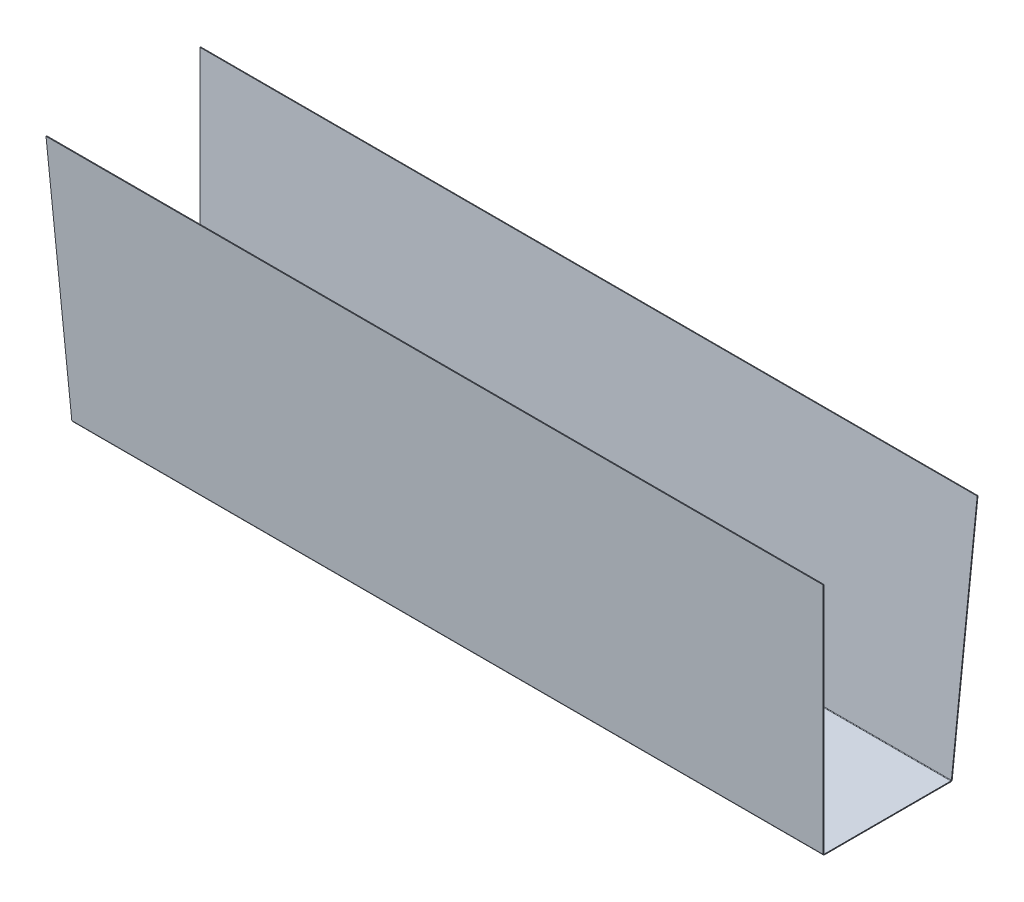
ISO-10303-21;
HEADER;
FILE_DESCRIPTION(('STEP AP214'),'2;1');
FILE_NAME('part.step','',(''),(''),'','','');
FILE_SCHEMA(('AUTOMOTIVE_DESIGN { 1 0 10303 214 1 1 1 1 }'));
ENDSEC;
DATA;
#1=APPLICATION_CONTEXT('core data for automotive mechanical design processes');
#2=APPLICATION_PROTOCOL_DEFINITION('international standard','automotive_design',2000,#1);
#3=PRODUCT_CONTEXT('',#1,'mechanical');
#4=PRODUCT('Part','Part','',(#3));
#5=PRODUCT_RELATED_PRODUCT_CATEGORY('part','',(#4));
#6=PRODUCT_DEFINITION_FORMATION('','',#4);
#7=PRODUCT_DEFINITION_CONTEXT('part definition',#1,'design');
#8=PRODUCT_DEFINITION('design','',#6,#7);
#9=PRODUCT_DEFINITION_SHAPE('','',#8);
#10=(LENGTH_UNIT() NAMED_UNIT(*) SI_UNIT(.MILLI.,.METRE.));
#11=(NAMED_UNIT(*) PLANE_ANGLE_UNIT() SI_UNIT($,.RADIAN.));
#12=(NAMED_UNIT(*) SI_UNIT($,.STERADIAN.) SOLID_ANGLE_UNIT());
#13=UNCERTAINTY_MEASURE_WITH_UNIT(LENGTH_MEASURE(1.E-05),#10,'distance_accuracy_value','');
#14=(GEOMETRIC_REPRESENTATION_CONTEXT(3) GLOBAL_UNCERTAINTY_ASSIGNED_CONTEXT((#13)) GLOBAL_UNIT_ASSIGNED_CONTEXT((#10,
#11,#12)) REPRESENTATION_CONTEXT('',''));
#15=CARTESIAN_POINT('',(0.,0.,0.));
#16=DIRECTION('',(0.,0.,1.));
#17=DIRECTION('',(1.,0.,0.));
#18=AXIS2_PLACEMENT_3D('',#15,#16,#17);
#19=CARTESIAN_POINT('',(1522.4125,-483.049083330536,-276.31164885721));
#20=DIRECTION('',(0.,0.0523359562429431,0.998629534754574));
#21=DIRECTION('',(0.,-0.998629534754574,0.0523359562429431));
#22=AXIS2_PLACEMENT_3D('',#19,#20,#21);
#23=PLANE('',#22);
#24=DIRECTION('',(0.0522644276887175,0.997264688634237,-0.0522644276887132));
#25=VECTOR('',#24,1.);
#26=CARTESIAN_POINT('',(1497.16612140968,-481.729600751976,-276.380800008955));
#27=LINE('',#26,#25);
#28=CARTESIAN_POINT('',(1497.14663522598,-482.101419286779,-276.36131382525));
#29=VERTEX_POINT('',#28);
#30=CARTESIAN_POINT('',(1522.40814578715,-0.0830833305356937,-301.622824386423));
#31=VERTEX_POINT('',#30);
#32=EDGE_CURVE('E310',#29,#31,#27,.T.);
#33=ORIENTED_EDGE('',*,*,#32,.F.);
#34=DIRECTION('',(-1.,0.,0.));
#35=VECTOR('',#34,1.);
#36=CARTESIAN_POINT('',(1522.4125,-482.101419286779,-276.36131382525));
#37=LINE('',#36,#35);
#38=CARTESIAN_POINT('',(25.265864774024,-482.101419286779,-276.36131382525));
#39=VERTEX_POINT('',#38);
#40=EDGE_CURVE('E50',#29,#39,#37,.T.);
#41=ORIENTED_EDGE('',*,*,#40,.T.);
#42=DIRECTION('',(-0.0522644276887175,0.997264688634237,-0.0522644276887132));
#43=VECTOR('',#42,1.);
#44=CARTESIAN_POINT('',(29.4049555143889,-561.079975466588,-272.222223084885));
#45=LINE('',#44,#43);
#46=CARTESIAN_POINT('',(0.00435421284876904,-0.0830833305356971,-301.622824386423));
#47=VERTEX_POINT('',#46);
#48=EDGE_CURVE('E224',#39,#47,#45,.T.);
#49=ORIENTED_EDGE('',*,*,#48,.T.);
#50=DIRECTION('',(-1.,0.,0.));
#51=VECTOR('',#50,1.);
#52=CARTESIAN_POINT('',(1522.4125,-0.0830833305356937,-301.622824386423));
#53=LINE('',#52,#51);
#54=EDGE_CURVE('E11',#31,#47,#53,.T.);
#55=ORIENTED_EDGE('',*,*,#54,.F.);
#56=EDGE_LOOP('',(#33,#41,#49,#55));
#57=FACE_BOUND('',#56,.T.);
#58=ADVANCED_FACE('F36',(#57),#23,.F.);
#59=CARTESIAN_POINT('',(1522.4125,0.,-300.0375));
#60=DIRECTION('',(0.,0.998629534754573,-0.0523359562429564));
#61=DIRECTION('',(0.,0.0523359562429564,0.998629534754573));
#62=AXIS2_PLACEMENT_3D('',#59,#60,#61);
#63=PLANE('',#62);
#64=DIRECTION('',(-1.,0.,0.));
#65=VECTOR('',#64,1.);
#66=CARTESIAN_POINT('',(1522.4125,0.,-300.0375));
#67=LINE('',#66,#65);
#68=CARTESIAN_POINT('',(1522.40814578715,1.11022302462516E-13,-300.0375));
#69=VERTEX_POINT('',#68);
#70=CARTESIAN_POINT('',(0.00435421284872284,1.11022302462516E-13,-300.0375));
#71=VERTEX_POINT('',#70);
#72=EDGE_CURVE('E43',#69,#71,#67,.T.);
#73=ORIENTED_EDGE('',*,*,#72,.F.);
#74=DIRECTION('',(0.,-0.0523359562429431,-0.998629534754574));
#75=VECTOR('',#74,1.);
#76=CARTESIAN_POINT('',(1522.40814578715,-0.0830833305356937,-301.622824386423));
#77=LINE('',#76,#75);
#78=EDGE_CURVE('E298',#31,#69,#77,.F.);
#79=ORIENTED_EDGE('',*,*,#78,.F.);
#80=ORIENTED_EDGE('',*,*,#54,.T.);
#81=DIRECTION('',(0.,-0.0523359562429431,-0.998629534754574));
#82=VECTOR('',#81,1.);
#83=CARTESIAN_POINT('',(0.00435421284876904,-0.0830833305356971,-301.622824386423));
#84=LINE('',#83,#82);
#85=EDGE_CURVE('E222',#47,#71,#84,.F.);
#86=ORIENTED_EDGE('',*,*,#85,.T.);
#87=EDGE_LOOP('',(#73,#79,#80,#86));
#88=FACE_BOUND('',#87,.T.);
#89=ADVANCED_FACE('F226',(#88),#63,.T.);
#90=CARTESIAN_POINT('',(1522.4125,-482.966,-274.726324470787));
#91=DIRECTION('',(0.,0.0523359562429431,0.998629534754574));
#92=DIRECTION('',(0.,-0.998629534754574,0.0523359562429431));
#93=AXIS2_PLACEMENT_3D('',#90,#91,#92);
#94=PLANE('',#93);
#95=DIRECTION('',(-1.,0.,0.));
#96=VECTOR('',#95,1.);
#97=CARTESIAN_POINT('',(1522.4125,-482.018335956243,-274.775989438827));
#98=LINE('',#97,#96);
#99=CARTESIAN_POINT('',(1497.14663522598,-482.018335956243,-274.775989438827));
#100=VERTEX_POINT('',#99);
#101=CARTESIAN_POINT('',(25.265864774024,-482.018335956243,-274.775989438827));
#102=VERTEX_POINT('',#101);
#103=EDGE_CURVE('E204',#100,#102,#98,.T.);
#104=ORIENTED_EDGE('',*,*,#103,.F.);
#105=DIRECTION('',(0.0522644276887175,0.997264688634237,-0.0522644276887132));
#106=VECTOR('',#105,1.);
#107=CARTESIAN_POINT('',(1497.16612140968,-481.64651742144,-274.795475622532));
#108=LINE('',#107,#106);
#109=EDGE_CURVE('E213',#100,#69,#108,.T.);
#110=ORIENTED_EDGE('',*,*,#109,.T.);
#111=ORIENTED_EDGE('',*,*,#72,.T.);
#112=DIRECTION('',(-0.0522644276887175,0.997264688634237,-0.0522644276887132));
#113=VECTOR('',#112,1.);
#114=CARTESIAN_POINT('',(29.4049555143889,-560.996892136052,-270.636898698462));
#115=LINE('',#114,#113);
#116=EDGE_CURVE('E212',#102,#71,#115,.T.);
#117=ORIENTED_EDGE('',*,*,#116,.F.);
#118=EDGE_LOOP('',(#104,#110,#111,#117));
#119=FACE_BOUND('',#118,.T.);
#120=ADVANCED_FACE('F211',(#119),#94,.T.);
#121=CARTESIAN_POINT('',(1522.4125,-481.966,-273.777359904072));
#122=DIRECTION('',(-1.,0.,0.));
#123=DIRECTION('',(0.,0.,1.));
#124=AXIS2_PLACEMENT_3D('',#121,#122,#123);
#125=CYLINDRICAL_SURFACE('',#124,1.);
#126=DIRECTION('',(-1.,0.,0.));
#127=VECTOR('',#126,1.);
#128=CARTESIAN_POINT('',(1522.4125,-482.966,-273.777359904072));
#129=LINE('',#128,#127);
#130=CARTESIAN_POINT('',(1497.01812712117,-482.966,-273.777359904072));
#131=VERTEX_POINT('',#130);
#132=CARTESIAN_POINT('',(25.3943728788268,-482.966,-273.777359904072));
#133=VERTEX_POINT('',#132);
#134=EDGE_CURVE('E202',#131,#133,#129,.T.);
#135=ORIENTED_EDGE('',*,*,#134,.F.);
#136=CARTESIAN_POINT('',(1497.15373225007,-481.966,-273.777359904072));
#137=DIRECTION('',(0.990930516924706,-0.134375260473553,0.));
#138=DIRECTION('',(-0.134375260473553,-0.990930516924706,0.));
#139=AXIS2_PLACEMENT_3D('',#136,#137,#138);
#140=ELLIPSE('',#139,1.00915249144152,1.);
#141=EDGE_CURVE('E181',#131,#100,#140,.T.);
#142=ORIENTED_EDGE('',*,*,#141,.T.);
#143=ORIENTED_EDGE('',*,*,#103,.T.);
#144=CARTESIAN_POINT('',(25.2587677499319,-481.966,-273.777359904072));
#145=DIRECTION('',(0.99093051692473,0.134375260473377,0.));
#146=DIRECTION('',(-0.134375260473377,0.99093051692473,0.));
#147=AXIS2_PLACEMENT_3D('',#144,#145,#146);
#148=ELLIPSE('',#147,1.0091524914415,1.);
#149=EDGE_CURVE('E282',#133,#102,#148,.T.);
#150=ORIENTED_EDGE('',*,*,#149,.F.);
#151=EDGE_LOOP('',(#135,#142,#143,#150));
#152=FACE_BOUND('',#151,.T.);
#153=ADVANCED_FACE('F341',(#152),#125,.F.);
#154=CARTESIAN_POINT('',(1522.4125,-482.966,-25.3111755292116));
#155=DIRECTION('',(0.,1.,0.));
#156=DIRECTION('',(0.,0.,1.));
#157=AXIS2_PLACEMENT_3D('',#154,#155,#156);
#158=PLANE('',#157);
#159=DIRECTION('',(-1.,0.,0.));
#160=VECTOR('',#159,1.);
#161=CARTESIAN_POINT('',(1522.4125,-482.966,-26.2601400959265));
#162=LINE('',#161,#160);
#163=CARTESIAN_POINT('',(1497.01812712117,-482.966,-26.2601400959265));
#164=VERTEX_POINT('',#163);
#165=CARTESIAN_POINT('',(25.3943728788268,-482.966,-26.2601400959265));
#166=VERTEX_POINT('',#165);
#167=EDGE_CURVE('E200',#164,#166,#162,.T.);
#168=ORIENTED_EDGE('',*,*,#167,.F.);
#169=DIRECTION('',(0.,0.,1.));
#170=VECTOR('',#169,1.);
#171=CARTESIAN_POINT('',(1497.01812712117,-482.966,-25.3111755292116));
#172=LINE('',#171,#170);
#173=EDGE_CURVE('E297',#131,#164,#172,.T.);
#174=ORIENTED_EDGE('',*,*,#173,.F.);
#175=ORIENTED_EDGE('',*,*,#134,.T.);
#176=DIRECTION('',(0.,0.,1.));
#177=VECTOR('',#176,1.);
#178=CARTESIAN_POINT('',(25.3943728788268,-482.966,-25.3111755292116));
#179=LINE('',#178,#177);
#180=EDGE_CURVE('E231',#133,#166,#179,.T.);
#181=ORIENTED_EDGE('',*,*,#180,.T.);
#182=EDGE_LOOP('',(#168,#174,#175,#181));
#183=FACE_BOUND('',#182,.T.);
#184=ADVANCED_FACE('F336',(#183),#158,.T.);
#185=CARTESIAN_POINT('',(1522.4125,-481.966,-26.2601400959265));
#186=DIRECTION('',(-1.,0.,0.));
#187=DIRECTION('',(0.,0.,1.));
#188=AXIS2_PLACEMENT_3D('',#185,#186,#187);
#189=CYLINDRICAL_SURFACE('',#188,1.);
#190=DIRECTION('',(-1.,0.,0.));
#191=VECTOR('',#190,1.);
#192=CARTESIAN_POINT('',(1522.4125,-482.018335956243,-25.2615105611719));
#193=LINE('',#192,#191);
#194=CARTESIAN_POINT('',(1497.14663522598,-482.018335956243,-25.2615105611719));
#195=VERTEX_POINT('',#194);
#196=CARTESIAN_POINT('',(25.265864774024,-482.018335956243,-25.2615105611719));
#197=VERTEX_POINT('',#196);
#198=EDGE_CURVE('E198',#195,#197,#193,.T.);
#199=ORIENTED_EDGE('',*,*,#198,.F.);
#200=CARTESIAN_POINT('',(1497.15373225007,-481.966,-26.2601400959265));
#201=DIRECTION('',(0.990930516924706,-0.134375260473553,0.));
#202=DIRECTION('',(-0.134375260473553,-0.990930516924706,0.));
#203=AXIS2_PLACEMENT_3D('',#200,#201,#202);
#204=ELLIPSE('',#203,1.00915249144152,1.);
#205=EDGE_CURVE('E157',#195,#164,#204,.T.);
#206=ORIENTED_EDGE('',*,*,#205,.T.);
#207=ORIENTED_EDGE('',*,*,#167,.T.);
#208=CARTESIAN_POINT('',(25.2587677499319,-481.966,-26.2601400959265));
#209=DIRECTION('',(0.99093051692473,0.134375260473377,0.));
#210=DIRECTION('',(-0.134375260473377,0.99093051692473,0.));
#211=AXIS2_PLACEMENT_3D('',#208,#209,#210);
#212=ELLIPSE('',#211,1.0091524914415,1.);
#213=EDGE_CURVE('E326',#197,#166,#212,.T.);
#214=ORIENTED_EDGE('',*,*,#213,.F.);
#215=EDGE_LOOP('',(#199,#206,#207,#214));
#216=FACE_BOUND('',#215,.T.);
#217=ADVANCED_FACE('F347',(#216),#189,.F.);
#218=CARTESIAN_POINT('',(1522.4125,0.,0.));
#219=DIRECTION('',(0.,0.0523359562429404,-0.998629534754574));
#220=DIRECTION('',(0.,0.998629534754574,0.0523359562429404));
#221=AXIS2_PLACEMENT_3D('',#218,#219,#220);
#222=PLANE('',#221);
#223=DIRECTION('',(1.,0.,0.));
#224=VECTOR('',#223,1.);
#225=CARTESIAN_POINT('',(1522.4125,-30.2497913117226,-1.58532438642271));
#226=LINE('',#225,#224);
#227=CARTESIAN_POINT('',(1520.82717561358,-30.2497913117226,-1.58532438642271));
#228=VERTEX_POINT('',#227);
#229=CARTESIAN_POINT('',(1520.82282140073,-30.2497913117259,-1.58532438642289));
#230=VERTEX_POINT('',#229);
#231=EDGE_CURVE('E171',#228,#230,#226,.F.);
#232=ORIENTED_EDGE('',*,*,#231,.T.);
#233=DIRECTION('',(-0.0522644276887175,-0.997264688634237,-0.0522644276887105));
#234=VECTOR('',#233,1.);
#235=CARTESIAN_POINT('',(1522.40815768099,0.000226947966559967,1.18938389408619E-05));
#236=LINE('',#235,#234);
#237=EDGE_CURVE('E322',#230,#195,#236,.T.);
#238=ORIENTED_EDGE('',*,*,#237,.T.);
#239=ORIENTED_EDGE('',*,*,#198,.T.);
#240=DIRECTION('',(0.0522644276887175,-0.997264688634237,-0.0522644276887105));
#241=VECTOR('',#240,1.);
#242=CARTESIAN_POINT('',(4.16291924307988,-79.3501477666454,-4.15856503023079));
#243=LINE('',#242,#241);
#244=CARTESIAN_POINT('',(1.58967859927195,-30.2497913117259,-1.58532438642289));
#245=VERTEX_POINT('',#244);
#246=EDGE_CURVE('E245',#245,#197,#243,.T.);
#247=ORIENTED_EDGE('',*,*,#246,.F.);
#248=DIRECTION('',(1.,0.,0.));
#249=VECTOR('',#248,1.);
#250=CARTESIAN_POINT('',(1522.4125,-30.2497913117259,-1.58532438642289));
#251=LINE('',#250,#249);
#252=CARTESIAN_POINT('',(1.58532438642289,-30.2497913117259,-1.58532438642289));
#253=VERTEX_POINT('',#252);
#254=EDGE_CURVE('E248',#245,#253,#251,.F.);
#255=ORIENTED_EDGE('',*,*,#254,.T.);
#256=DIRECTION('',(0.0522644276887175,-0.997264688634237,-0.0522644276887105));
#257=VECTOR('',#256,1.);
#258=CARTESIAN_POINT('',(4.15857692407018,-79.350374714612,-4.15857692406973));
#259=LINE('',#258,#257);
#260=CARTESIAN_POINT('',(0.,0.,0.));
#261=VERTEX_POINT('',#260);
#262=EDGE_CURVE('E240',#261,#253,#259,.T.);
#263=ORIENTED_EDGE('',*,*,#262,.F.);
#264=DIRECTION('',(-1.,0.,0.));
#265=VECTOR('',#264,1.);
#266=CARTESIAN_POINT('',(1522.4125,0.,0.));
#267=LINE('',#266,#265);
#268=CARTESIAN_POINT('',(1522.4125,0.,0.));
#269=VERTEX_POINT('',#268);
#270=EDGE_CURVE('E190',#269,#261,#267,.T.);
#271=ORIENTED_EDGE('',*,*,#270,.F.);
#272=DIRECTION('',(-0.0522644276887175,-0.997264688634237,-0.0522644276887105));
#273=VECTOR('',#272,1.);
#274=CARTESIAN_POINT('',(1522.4125,0.,0.));
#275=LINE('',#274,#273);
#276=EDGE_CURVE('E58',#269,#228,#275,.T.);
#277=ORIENTED_EDGE('',*,*,#276,.T.);
#278=EDGE_LOOP('',(#232,#238,#239,#247,#255,#263,#271,#277));
#279=FACE_BOUND('',#278,.T.);
#280=ADVANCED_FACE('F351',(#279),#222,.T.);
#281=CARTESIAN_POINT('',(1522.4125,-0.0830833305356679,1.58532438642289));
#282=DIRECTION('',(0.,0.0523359562429404,-0.998629534754574));
#283=DIRECTION('',(0.,0.998629534754574,0.0523359562429404));
#284=AXIS2_PLACEMENT_3D('',#281,#282,#283);
#285=PLANE('',#284);
#286=DIRECTION('',(-0.0522644276887175,-0.997264688634237,-0.0522644276887105));
#287=VECTOR('',#286,1.);
#288=CARTESIAN_POINT('',(1522.40815768099,-0.0828563825691079,1.58533628026183));
#289=LINE('',#288,#287);
#290=CARTESIAN_POINT('',(1520.82282140073,-30.3328746422616,0.));
#291=VERTEX_POINT('',#290);
#292=CARTESIAN_POINT('',(1497.14663522598,-482.101419286778,-23.676186174749));
#293=VERTEX_POINT('',#292);
#294=EDGE_CURVE('E165',#291,#293,#289,.T.);
#295=ORIENTED_EDGE('',*,*,#294,.F.);
#296=DIRECTION('',(-1.,0.,0.));
#297=VECTOR('',#296,1.);
#298=CARTESIAN_POINT('',(1522.4125,-30.3328746422616,0.));
#299=LINE('',#298,#297);
#300=CARTESIAN_POINT('',(1520.82717561358,-30.3328746422616,0.));
#301=VERTEX_POINT('',#300);
#302=EDGE_CURVE('E172',#301,#291,#299,.T.);
#303=ORIENTED_EDGE('',*,*,#302,.F.);
#304=DIRECTION('',(-0.0522644276887175,-0.997264688634237,-0.0522644276887105));
#305=VECTOR('',#304,1.);
#306=CARTESIAN_POINT('',(1522.4125,-0.0830833305356679,1.58532438642289));
#307=LINE('',#306,#305);
#308=CARTESIAN_POINT('',(1522.4125,-0.0830833305356679,1.58532438642289));
#309=VERTEX_POINT('',#308);
#310=EDGE_CURVE('E314',#309,#301,#307,.T.);
#311=ORIENTED_EDGE('',*,*,#310,.F.);
#312=DIRECTION('',(-1.,0.,0.));
#313=VECTOR('',#312,1.);
#314=CARTESIAN_POINT('',(1522.4125,-0.0830833305356679,1.58532438642289));
#315=LINE('',#314,#313);
#316=CARTESIAN_POINT('',(0.,-0.0830833305356679,1.58532438642289));
#317=VERTEX_POINT('',#316);
#318=EDGE_CURVE('E187',#309,#317,#315,.T.);
#319=ORIENTED_EDGE('',*,*,#318,.T.);
#320=DIRECTION('',(0.0522644276887175,-0.997264688634237,-0.0522644276887105));
#321=VECTOR('',#320,1.);
#322=CARTESIAN_POINT('',(4.15857692407018,-79.4334580451477,-2.57325253764684));
#323=LINE('',#322,#321);
#324=CARTESIAN_POINT('',(1.58532438642289,-30.3328746422616,0.));
#325=VERTEX_POINT('',#324);
#326=EDGE_CURVE('E236',#317,#325,#323,.T.);
#327=ORIENTED_EDGE('',*,*,#326,.T.);
#328=DIRECTION('',(-1.,0.,0.));
#329=VECTOR('',#328,1.);
#330=CARTESIAN_POINT('',(1522.4125,-30.3328746422616,0.));
#331=LINE('',#330,#329);
#332=CARTESIAN_POINT('',(1.58967859927193,-30.3328746422616,0.));
#333=VERTEX_POINT('',#332);
#334=EDGE_CURVE('E249',#333,#325,#331,.T.);
#335=ORIENTED_EDGE('',*,*,#334,.F.);
#336=DIRECTION('',(0.0522644276887175,-0.997264688634237,-0.0522644276887105));
#337=VECTOR('',#336,1.);
#338=CARTESIAN_POINT('',(4.16291924307988,-79.4332310971811,-2.5732406438079));
#339=LINE('',#338,#337);
#340=CARTESIAN_POINT('',(25.265864774024,-482.101419286778,-23.676186174749));
#341=VERTEX_POINT('',#340);
#342=EDGE_CURVE('E186',#333,#341,#339,.T.);
#343=ORIENTED_EDGE('',*,*,#342,.T.);
#344=DIRECTION('',(-1.,0.,0.));
#345=VECTOR('',#344,1.);
#346=CARTESIAN_POINT('',(1522.4125,-482.101419286778,-23.676186174749));
#347=LINE('',#346,#345);
#348=EDGE_CURVE('E178',#293,#341,#347,.T.);
#349=ORIENTED_EDGE('',*,*,#348,.F.);
#350=EDGE_LOOP('',(#295,#303,#311,#319,#327,#335,#343,#349));
#351=FACE_BOUND('',#350,.T.);
#352=ADVANCED_FACE('F184',(#351),#285,.F.);
#353=CARTESIAN_POINT('',(1522.4125,-481.966,-26.2601400959265));
#354=DIRECTION('',(-1.,0.,0.));
#355=DIRECTION('',(0.,0.,1.));
#356=AXIS2_PLACEMENT_3D('',#353,#354,#355);
#357=CYLINDRICAL_SURFACE('',#356,2.5875);
#358=CARTESIAN_POINT('',(1497.15373225007,-481.966,-26.2601400959265));
#359=DIRECTION('',(0.998629534754574,-0.0523359562429474,0.));
#360=DIRECTION('',(-0.0523359562429474,-0.998629534754574,0.));
#361=AXIS2_PLACEMENT_3D('',#358,#359,#360);
#362=ELLIPSE('',#361,2.59105094526962,2.5875);
#363=CARTESIAN_POINT('',(1497.01812712117,-484.5535,-26.2601400959265));
#364=VERTEX_POINT('',#363);
#365=EDGE_CURVE('E154',#293,#364,#362,.T.);
#366=ORIENTED_EDGE('',*,*,#365,.F.);
#367=ORIENTED_EDGE('',*,*,#348,.T.);
#368=CARTESIAN_POINT('',(25.2587677499319,-481.966,-26.2601400959265));
#369=DIRECTION('',(0.998629534754574,0.0523359562429474,0.));
#370=DIRECTION('',(-0.0523359562429474,0.998629534754574,0.));
#371=AXIS2_PLACEMENT_3D('',#368,#369,#370);
#372=ELLIPSE('',#371,2.59105094526962,2.5875);
#373=CARTESIAN_POINT('',(25.3943728788268,-484.5535,-26.2601400959265));
#374=VERTEX_POINT('',#373);
#375=EDGE_CURVE('E329',#341,#374,#372,.T.);
#376=ORIENTED_EDGE('',*,*,#375,.T.);
#377=DIRECTION('',(-1.,0.,0.));
#378=VECTOR('',#377,1.);
#379=CARTESIAN_POINT('',(1522.4125,-484.5535,-26.2601400959265));
#380=LINE('',#379,#378);
#381=EDGE_CURVE('E180',#364,#374,#380,.T.);
#382=ORIENTED_EDGE('',*,*,#381,.F.);
#383=EDGE_LOOP('',(#366,#367,#376,#382));
#384=FACE_BOUND('',#383,.T.);
#385=ADVANCED_FACE('F176',(#384),#357,.T.);
#386=CARTESIAN_POINT('',(1522.4125,-484.5535,-25.3111755292116));
#387=DIRECTION('',(0.,1.,0.));
#388=DIRECTION('',(0.,0.,1.));
#389=AXIS2_PLACEMENT_3D('',#386,#387,#388);
#390=PLANE('',#389);
#391=DIRECTION('',(0.,0.,1.));
#392=VECTOR('',#391,1.);
#393=CARTESIAN_POINT('',(1497.01812712117,-484.5535,-301.622824386423));
#394=LINE('',#393,#392);
#395=CARTESIAN_POINT('',(1497.01812712117,-484.5535,-273.777359904072));
#396=VERTEX_POINT('',#395);
#397=EDGE_CURVE('E293',#396,#364,#394,.T.);
#398=ORIENTED_EDGE('',*,*,#397,.T.);
#399=ORIENTED_EDGE('',*,*,#381,.T.);
#400=DIRECTION('',(0.,0.,1.));
#401=VECTOR('',#400,1.);
#402=CARTESIAN_POINT('',(25.3943728788268,-484.5535,-301.622824386423));
#403=LINE('',#402,#401);
#404=CARTESIAN_POINT('',(25.3943728788268,-484.5535,-273.777359904072));
#405=VERTEX_POINT('',#404);
#406=EDGE_CURVE('E228',#405,#374,#403,.T.);
#407=ORIENTED_EDGE('',*,*,#406,.F.);
#408=DIRECTION('',(-1.,0.,0.));
#409=VECTOR('',#408,1.);
#410=CARTESIAN_POINT('',(1522.4125,-484.5535,-273.777359904072));
#411=LINE('',#410,#409);
#412=EDGE_CURVE('E192',#396,#405,#411,.T.);
#413=ORIENTED_EDGE('',*,*,#412,.F.);
#414=EDGE_LOOP('',(#398,#399,#407,#413));
#415=FACE_BOUND('',#414,.T.);
#416=ADVANCED_FACE('F292',(#415),#390,.F.);
#417=CARTESIAN_POINT('',(1522.4125,-481.966,-273.777359904072));
#418=DIRECTION('',(-1.,0.,0.));
#419=DIRECTION('',(0.,0.,1.));
#420=AXIS2_PLACEMENT_3D('',#417,#418,#419);
#421=CYLINDRICAL_SURFACE('',#420,2.5875);
#422=CARTESIAN_POINT('',(1497.15373225007,-481.966,-273.777359904072));
#423=DIRECTION('',(0.998629534754574,-0.0523359562429474,0.));
#424=DIRECTION('',(-0.0523359562429474,-0.998629534754574,0.));
#425=AXIS2_PLACEMENT_3D('',#422,#423,#424);
#426=ELLIPSE('',#425,2.59105094526962,2.5875);
#427=EDGE_CURVE('E272',#396,#29,#426,.T.);
#428=ORIENTED_EDGE('',*,*,#427,.F.);
#429=ORIENTED_EDGE('',*,*,#412,.T.);
#430=CARTESIAN_POINT('',(25.2587677499319,-481.966,-273.777359904072));
#431=DIRECTION('',(0.998629534754574,0.0523359562429474,0.));
#432=DIRECTION('',(-0.0523359562429474,0.998629534754574,0.));
#433=AXIS2_PLACEMENT_3D('',#430,#431,#432);
#434=ELLIPSE('',#433,2.59105094526962,2.5875);
#435=EDGE_CURVE('E160',#405,#39,#434,.T.);
#436=ORIENTED_EDGE('',*,*,#435,.T.);
#437=ORIENTED_EDGE('',*,*,#40,.F.);
#438=EDGE_LOOP('',(#428,#429,#436,#437));
#439=FACE_BOUND('',#438,.T.);
#440=ADVANCED_FACE('F271',(#439),#421,.T.);
#441=CARTESIAN_POINT('',(1522.4125,-0.0830833305356679,1.58532438642289));
#442=DIRECTION('',(0.,0.998629534754574,0.0523359562429404));
#443=DIRECTION('',(0.,-0.0523359562429404,0.998629534754574));
#444=AXIS2_PLACEMENT_3D('',#441,#442,#443);
#445=PLANE('',#444);
#446=DIRECTION('',(0.,0.0523359562429404,-0.998629534754574));
#447=VECTOR('',#446,1.);
#448=CARTESIAN_POINT('',(0.,-0.0830833305356679,1.58532438642289));
#449=LINE('',#448,#447);
#450=EDGE_CURVE('E259',#317,#261,#449,.T.);
#451=ORIENTED_EDGE('',*,*,#450,.F.);
#452=ORIENTED_EDGE('',*,*,#318,.F.);
#453=DIRECTION('',(0.,0.0523359562429404,-0.998629534754574));
#454=VECTOR('',#453,1.);
#455=CARTESIAN_POINT('',(1522.4125,-0.0830833305356679,1.58532438642289));
#456=LINE('',#455,#454);
#457=EDGE_CURVE('E262',#309,#269,#456,.T.);
#458=ORIENTED_EDGE('',*,*,#457,.T.);
#459=ORIENTED_EDGE('',*,*,#270,.T.);
#460=EDGE_LOOP('',(#451,#452,#458,#459));
#461=FACE_BOUND('',#460,.T.);
#462=ADVANCED_FACE('F529',(#461),#445,.T.);
#463=CARTESIAN_POINT('',(1522.4125,-30.3328746422616,0.));
#464=DIRECTION('',(0.,-0.998629534754574,-0.0523359562429404));
#465=DIRECTION('',(-1.,0.,0.));
#466=AXIS2_PLACEMENT_3D('',#463,#464,#465);
#467=PLANE('',#466);
#468=DIRECTION('',(0.,-0.0523359562429404,0.998629534754574));
#469=VECTOR('',#468,1.);
#470=CARTESIAN_POINT('',(1.58532438642278,-30.3328746422616,0.));
#471=LINE('',#470,#469);
#472=EDGE_CURVE('E239',#325,#253,#471,.F.);
#473=ORIENTED_EDGE('',*,*,#472,.T.);
#474=ORIENTED_EDGE('',*,*,#254,.F.);
#475=DIRECTION('',(0.,-0.0523359562429404,0.998629534754574));
#476=VECTOR('',#475,1.);
#477=CARTESIAN_POINT('',(1.58967859927193,-30.3328746422616,0.));
#478=LINE('',#477,#476);
#479=EDGE_CURVE('E252',#333,#245,#478,.F.);
#480=ORIENTED_EDGE('',*,*,#479,.F.);
#481=ORIENTED_EDGE('',*,*,#334,.T.);
#482=EDGE_LOOP('',(#473,#474,#480,#481));
#483=FACE_BOUND('',#482,.T.);
#484=ADVANCED_FACE('F574',(#483),#467,.T.);
#485=CARTESIAN_POINT('',(4.16291924307988,-79.4332310971811,-2.5732406438079));
#486=DIRECTION('',(0.998633280838552,0.052192801106998,0.00273530880057904));
#487=DIRECTION('',(0.0522644276887175,-0.997264688634237,-0.0522644276887105));
#488=AXIS2_PLACEMENT_3D('',#485,#486,#487);
#489=PLANE('',#488);
#490=DIRECTION('',(0.,-0.0523359562429404,0.998629534754574));
#491=VECTOR('',#490,1.);
#492=CARTESIAN_POINT('',(25.265864774024,-482.101419286778,-23.676186174749));
#493=LINE('',#492,#491);
#494=EDGE_CURVE('E256',#341,#197,#493,.F.);
#495=ORIENTED_EDGE('',*,*,#494,.F.);
#496=ORIENTED_EDGE('',*,*,#342,.F.);
#497=ORIENTED_EDGE('',*,*,#479,.T.);
#498=ORIENTED_EDGE('',*,*,#246,.T.);
#499=EDGE_LOOP('',(#495,#496,#497,#498));
#500=FACE_BOUND('',#499,.T.);
#501=ADVANCED_FACE('F354',(#500),#489,.F.);
#502=CARTESIAN_POINT('',(4.15857692407018,-79.350374714612,-4.15857692406973));
#503=DIRECTION('',(0.998633280838552,0.052192801106998,0.00273530880057904));
#504=DIRECTION('',(0.0522644276887175,-0.997264688634237,-0.0522644276887105));
#505=AXIS2_PLACEMENT_3D('',#502,#503,#504);
#506=PLANE('',#505);
#507=ORIENTED_EDGE('',*,*,#326,.F.);
#508=ORIENTED_EDGE('',*,*,#450,.T.);
#509=ORIENTED_EDGE('',*,*,#262,.T.);
#510=ORIENTED_EDGE('',*,*,#472,.F.);
#511=EDGE_LOOP('',(#507,#508,#509,#510));
#512=FACE_BOUND('',#511,.T.);
#513=ADVANCED_FACE('F556',(#512),#506,.F.);
#514=CARTESIAN_POINT('',(29.4049555143889,-561.079975466588,-272.222223084885));
#515=DIRECTION('',(0.998633280838552,0.052192801106998,-0.00273530880057918));
#516=DIRECTION('',(-0.0522644276887175,0.997264688634237,-0.0522644276887132));
#517=AXIS2_PLACEMENT_3D('',#514,#515,#516);
#518=PLANE('',#517);
#519=ORIENTED_EDGE('',*,*,#85,.F.);
#520=ORIENTED_EDGE('',*,*,#48,.F.);
#521=DIRECTION('',(0.,-0.0523359562429431,-0.998629534754574));
#522=VECTOR('',#521,1.);
#523=CARTESIAN_POINT('',(25.265864774024,-482.101419286779,-276.36131382525));
#524=LINE('',#523,#522);
#525=EDGE_CURVE('E223',#39,#102,#524,.F.);
#526=ORIENTED_EDGE('',*,*,#525,.T.);
#527=ORIENTED_EDGE('',*,*,#116,.T.);
#528=EDGE_LOOP('',(#519,#520,#526,#527));
#529=FACE_BOUND('',#528,.T.);
#530=ADVANCED_FACE('F220',(#529),#518,.F.);
#531=CARTESIAN_POINT('',(25.123162621037,-480.966,-273.777359904072));
#532=CARTESIAN_POINT('',(25.123162621037,-480.436833333333,-273.777359904072));
#533=CARTESIAN_POINT('',(25.123162621037,-479.907666666667,-273.777359904072));
#534=CARTESIAN_POINT('',(25.123162621037,-479.3785,-273.777359904072));
#535=CARTESIAN_POINT('',(25.1231626210371,-480.966,-271.777359904072));
#536=CARTESIAN_POINT('',(25.123162621037,-480.436833333333,-270.719026570739));
#537=CARTESIAN_POINT('',(25.123162621037,-479.907666666667,-269.660693237406));
#538=CARTESIAN_POINT('',(25.123162621037,-479.3785,-268.602359904072));
#539=CARTESIAN_POINT('',(25.3943728788267,-482.966,-271.777359904072));
#540=CARTESIAN_POINT('',(25.3943728788267,-483.495166666667,-270.719026570739));
#541=CARTESIAN_POINT('',(25.3943728788267,-484.024333333333,-269.660693237406));
#542=CARTESIAN_POINT('',(25.3943728788267,-484.5535,-268.602359904072));
#543=CARTESIAN_POINT('',(25.3943728788267,-482.966,-273.777359904072));
#544=CARTESIAN_POINT('',(25.3943728788267,-483.495166666667,-273.777359904072));
#545=CARTESIAN_POINT('',(25.3943728788267,-484.024333333333,-273.777359904072));
#546=CARTESIAN_POINT('',(25.3943728788267,-484.5535,-273.777359904072));
#547=CARTESIAN_POINT('',(25.3943728788267,-482.966,-275.777359904072));
#548=CARTESIAN_POINT('',(25.3943728788267,-483.495166666667,-276.835693237406));
#549=CARTESIAN_POINT('',(25.3943728788267,-484.024333333333,-277.894026570739));
#550=CARTESIAN_POINT('',(25.3943728788267,-484.5535,-278.952359904072));
#551=CARTESIAN_POINT('',(25.1231626210371,-480.966,-275.777359904072));
#552=CARTESIAN_POINT('',(25.123162621037,-480.436833333333,-276.835693237406));
#553=CARTESIAN_POINT('',(25.123162621037,-479.907666666667,-277.894026570739));
#554=CARTESIAN_POINT('',(25.123162621037,-479.3785,-278.952359904072));
#555=CARTESIAN_POINT('',(25.123162621037,-480.966,-273.777359904072));
#556=CARTESIAN_POINT('',(25.123162621037,-480.436833333333,-273.777359904072));
#557=CARTESIAN_POINT('',(25.123162621037,-479.907666666667,-273.777359904072));
#558=CARTESIAN_POINT('',(25.123162621037,-479.3785,-273.777359904072));
#559=(BOUNDED_SURFACE() B_SPLINE_SURFACE(3,3,((#531,#532,#533,#534),(#535,#536,#537,#538),(#539,
#540,#541,#542),(#543,#544,#545,#546),(#547,#548,#549,#550),(#551,#552,#553,#554),(#555,#556,
#557,#558)),.UNSPECIFIED.,.T.,.F.,.F.) B_SPLINE_SURFACE_WITH_KNOTS((4,3,4),(4,4),(0.,0.5,1.),
(0.,1.),.UNSPECIFIED.) GEOMETRIC_REPRESENTATION_ITEM() RATIONAL_B_SPLINE_SURFACE(((1.,1.,1.,1.),
(0.333333333333333,0.333333333333333,0.333333333333333,0.333333333333333),(0.333333333333333,
0.333333333333333,0.333333333333333,0.333333333333333),(1.,1.,1.,1.),(0.333333333333333,
0.333333333333333,0.333333333333333,0.333333333333333),(0.333333333333333,0.333333333333333,
0.333333333333333,0.333333333333333),(1.,1.,1.,1.))) REPRESENTATION_ITEM('') SURFACE());
#560=DIRECTION('',(0.,-1.,0.));
#561=VECTOR('',#560,1.);
#562=CARTESIAN_POINT('',(25.3943728788268,-484.5535,-273.777359904072));
#563=LINE('',#562,#561);
#564=EDGE_CURVE('E243',#405,#133,#563,.F.);
#565=ORIENTED_EDGE('',*,*,#525,.F.);
#566=ORIENTED_EDGE('',*,*,#435,.F.);
#567=ORIENTED_EDGE('',*,*,#564,.T.);
#568=ORIENTED_EDGE('',*,*,#149,.T.);
#569=EDGE_LOOP('',(#565,#566,#567,#568));
#570=FACE_BOUND('',#569,.T.);
#571=ADVANCED_FACE('F279',(#570),#559,.T.);
#572=CARTESIAN_POINT('',(25.3943728788268,-484.5535,-301.622824386423));
#573=DIRECTION('',(-1.,0.,0.));
#574=DIRECTION('',(0.,0.,1.));
#575=AXIS2_PLACEMENT_3D('',#572,#573,#574);
#576=PLANE('',#575);
#577=ORIENTED_EDGE('',*,*,#564,.F.);
#578=ORIENTED_EDGE('',*,*,#406,.T.);
#579=DIRECTION('',(0.,-1.,0.));
#580=VECTOR('',#579,1.);
#581=CARTESIAN_POINT('',(25.3943728788268,-484.5535,-26.2601400959265));
#582=LINE('',#581,#580);
#583=EDGE_CURVE('E290',#374,#166,#582,.F.);
#584=ORIENTED_EDGE('',*,*,#583,.T.);
#585=ORIENTED_EDGE('',*,*,#180,.F.);
#586=EDGE_LOOP('',(#577,#578,#584,#585));
#587=FACE_BOUND('',#586,.T.);
#588=ADVANCED_FACE('F286',(#587),#576,.T.);
#589=CARTESIAN_POINT('',(25.123162621037,-480.966,-26.2601400959265));
#590=CARTESIAN_POINT('',(25.123162621037,-480.436833333333,-26.2601400959265));
#591=CARTESIAN_POINT('',(25.123162621037,-479.907666666667,-26.2601400959265));
#592=CARTESIAN_POINT('',(25.123162621037,-479.3785,-26.2601400959265));
#593=CARTESIAN_POINT('',(25.1231626210371,-480.966,-24.2601400959265));
#594=CARTESIAN_POINT('',(25.123162621037,-480.436833333333,-23.2018067625932));
#595=CARTESIAN_POINT('',(25.123162621037,-479.907666666667,-22.1434734292598));
#596=CARTESIAN_POINT('',(25.123162621037,-479.3785,-21.0851400959265));
#597=CARTESIAN_POINT('',(25.3943728788267,-482.966,-24.2601400959265));
#598=CARTESIAN_POINT('',(25.3943728788267,-483.495166666667,-23.2018067625932));
#599=CARTESIAN_POINT('',(25.3943728788267,-484.024333333333,-22.1434734292598));
#600=CARTESIAN_POINT('',(25.3943728788267,-484.5535,-21.0851400959265));
#601=CARTESIAN_POINT('',(25.3943728788267,-482.966,-26.2601400959265));
#602=CARTESIAN_POINT('',(25.3943728788267,-483.495166666667,-26.2601400959265));
#603=CARTESIAN_POINT('',(25.3943728788267,-484.024333333333,-26.2601400959265));
#604=CARTESIAN_POINT('',(25.3943728788267,-484.5535,-26.2601400959265));
#605=CARTESIAN_POINT('',(25.3943728788267,-482.966,-28.2601400959265));
#606=CARTESIAN_POINT('',(25.3943728788267,-483.495166666667,-29.3184734292599));
#607=CARTESIAN_POINT('',(25.3943728788267,-484.024333333333,-30.3768067625932));
#608=CARTESIAN_POINT('',(25.3943728788267,-484.5535,-31.4351400959265));
#609=CARTESIAN_POINT('',(25.1231626210371,-480.966,-28.2601400959265));
#610=CARTESIAN_POINT('',(25.123162621037,-480.436833333333,-29.3184734292599));
#611=CARTESIAN_POINT('',(25.123162621037,-479.907666666667,-30.3768067625932));
#612=CARTESIAN_POINT('',(25.123162621037,-479.3785,-31.4351400959265));
#613=CARTESIAN_POINT('',(25.123162621037,-480.966,-26.2601400959265));
#614=CARTESIAN_POINT('',(25.123162621037,-480.436833333333,-26.2601400959265));
#615=CARTESIAN_POINT('',(25.123162621037,-479.907666666667,-26.2601400959265));
#616=CARTESIAN_POINT('',(25.123162621037,-479.3785,-26.2601400959265));
#617=(BOUNDED_SURFACE() B_SPLINE_SURFACE(3,3,((#589,#590,#591,#592),(#593,#594,#595,#596),(#597,
#598,#599,#600),(#601,#602,#603,#604),(#605,#606,#607,#608),(#609,#610,#611,#612),(#613,#614,
#615,#616)),.UNSPECIFIED.,.T.,.F.,.F.) B_SPLINE_SURFACE_WITH_KNOTS((4,3,4),(4,4),(0.,0.5,1.),
(0.,1.),.UNSPECIFIED.) GEOMETRIC_REPRESENTATION_ITEM() RATIONAL_B_SPLINE_SURFACE(((1.,1.,1.,1.),
(0.333333333333333,0.333333333333333,0.333333333333333,0.333333333333333),(0.333333333333333,
0.333333333333333,0.333333333333333,0.333333333333333),(1.,1.,1.,1.),(0.333333333333333,
0.333333333333333,0.333333333333333,0.333333333333333),(0.333333333333333,0.333333333333333,
0.333333333333333,0.333333333333333),(1.,1.,1.,1.))) REPRESENTATION_ITEM('') SURFACE());
#618=ORIENTED_EDGE('',*,*,#583,.F.);
#619=ORIENTED_EDGE('',*,*,#375,.F.);
#620=ORIENTED_EDGE('',*,*,#494,.T.);
#621=ORIENTED_EDGE('',*,*,#213,.T.);
#622=EDGE_LOOP('',(#618,#619,#620,#621));
#623=FACE_BOUND('',#622,.T.);
#624=ADVANCED_FACE('F356',(#623),#617,.T.);
#625=CARTESIAN_POINT('',(1522.4125,-30.3328746422616,0.));
#626=DIRECTION('',(0.,-0.998629534754574,-0.0523359562429404));
#627=DIRECTION('',(-1.,0.,0.));
#628=AXIS2_PLACEMENT_3D('',#625,#626,#627);
#629=PLANE('',#628);
#630=DIRECTION('',(0.,-0.0523359562429404,0.998629534754574));
#631=VECTOR('',#630,1.);
#632=CARTESIAN_POINT('',(1520.82717561358,-30.3328746422616,0.));
#633=LINE('',#632,#631);
#634=EDGE_CURVE('E317',#228,#301,#633,.T.);
#635=ORIENTED_EDGE('',*,*,#634,.T.);
#636=ORIENTED_EDGE('',*,*,#302,.T.);
#637=DIRECTION('',(0.,-0.0523359562429404,0.998629534754574));
#638=VECTOR('',#637,1.);
#639=CARTESIAN_POINT('',(1520.82282140073,-30.3328746422616,0.));
#640=LINE('',#639,#638);
#641=EDGE_CURVE('E161',#291,#230,#640,.F.);
#642=ORIENTED_EDGE('',*,*,#641,.T.);
#643=ORIENTED_EDGE('',*,*,#231,.F.);
#644=EDGE_LOOP('',(#635,#636,#642,#643));
#645=FACE_BOUND('',#644,.T.);
#646=ADVANCED_FACE('F358',(#645),#629,.T.);
#647=CARTESIAN_POINT('',(1522.40815768099,-0.0828563825691079,1.58533628026183));
#648=DIRECTION('',(0.998633280838552,-0.052192801106998,-0.00273530880057904));
#649=DIRECTION('',(-0.0522644276887175,-0.997264688634237,-0.0522644276887105));
#650=AXIS2_PLACEMENT_3D('',#647,#648,#649);
#651=PLANE('',#650);
#652=ORIENTED_EDGE('',*,*,#294,.T.);
#653=DIRECTION('',(0.,-0.0523359562429404,0.998629534754574));
#654=VECTOR('',#653,1.);
#655=CARTESIAN_POINT('',(1497.14663522598,-482.101419286778,-23.676186174749));
#656=LINE('',#655,#654);
#657=EDGE_CURVE('E149',#293,#195,#656,.F.);
#658=ORIENTED_EDGE('',*,*,#657,.T.);
#659=ORIENTED_EDGE('',*,*,#237,.F.);
#660=ORIENTED_EDGE('',*,*,#641,.F.);
#661=EDGE_LOOP('',(#652,#658,#659,#660));
#662=FACE_BOUND('',#661,.T.);
#663=ADVANCED_FACE('F166',(#662),#651,.T.);
#664=CARTESIAN_POINT('',(1522.4125,0.,0.));
#665=DIRECTION('',(0.998633280838552,-0.052192801106998,-0.00273530880057904));
#666=DIRECTION('',(-0.0522644276887175,-0.997264688634237,-0.0522644276887105));
#667=AXIS2_PLACEMENT_3D('',#664,#665,#666);
#668=PLANE('',#667);
#669=ORIENTED_EDGE('',*,*,#276,.F.);
#670=ORIENTED_EDGE('',*,*,#457,.F.);
#671=ORIENTED_EDGE('',*,*,#310,.T.);
#672=ORIENTED_EDGE('',*,*,#634,.F.);
#673=EDGE_LOOP('',(#669,#670,#671,#672));
#674=FACE_BOUND('',#673,.T.);
#675=ADVANCED_FACE('F393',(#674),#668,.T.);
#676=CARTESIAN_POINT('',(1497.16612140968,-481.729600751976,-276.380800008955));
#677=DIRECTION('',(0.998633280838552,-0.052192801106998,0.00273530880057918));
#678=DIRECTION('',(0.0522644276887175,0.997264688634237,-0.0522644276887132));
#679=AXIS2_PLACEMENT_3D('',#676,#677,#678);
#680=PLANE('',#679);
#681=ORIENTED_EDGE('',*,*,#32,.T.);
#682=ORIENTED_EDGE('',*,*,#78,.T.);
#683=ORIENTED_EDGE('',*,*,#109,.F.);
#684=DIRECTION('',(0.,-0.0523359562429431,-0.998629534754574));
#685=VECTOR('',#684,1.);
#686=CARTESIAN_POINT('',(1497.14663522598,-482.101419286779,-276.36131382525));
#687=LINE('',#686,#685);
#688=EDGE_CURVE('E302',#29,#100,#687,.F.);
#689=ORIENTED_EDGE('',*,*,#688,.F.);
#690=EDGE_LOOP('',(#681,#682,#683,#689));
#691=FACE_BOUND('',#690,.T.);
#692=ADVANCED_FACE('F377',(#691),#680,.T.);
#693=CARTESIAN_POINT('',(1497.01812712117,-482.966,-273.777359904072));
#694=CARTESIAN_POINT('',(1497.01812712117,-483.495166666667,-273.777359904072));
#695=CARTESIAN_POINT('',(1497.01812712117,-484.024333333333,-273.777359904072));
#696=CARTESIAN_POINT('',(1497.01812712117,-484.5535,-273.777359904072));
#697=CARTESIAN_POINT('',(1497.01812712117,-482.966,-275.777359904072));
#698=CARTESIAN_POINT('',(1497.01812712117,-483.495166666667,-276.835693237406));
#699=CARTESIAN_POINT('',(1497.01812712117,-484.024333333333,-277.894026570739));
#700=CARTESIAN_POINT('',(1497.01812712117,-484.5535,-278.952359904072));
#701=CARTESIAN_POINT('',(1497.28933737896,-480.966,-275.777359904072));
#702=CARTESIAN_POINT('',(1497.28933737896,-480.436833333333,-276.835693237406));
#703=CARTESIAN_POINT('',(1497.28933737896,-479.907666666667,-277.894026570739));
#704=CARTESIAN_POINT('',(1497.28933737896,-479.3785,-278.952359904072));
#705=CARTESIAN_POINT('',(1497.28933737896,-480.966,-273.777359904072));
#706=CARTESIAN_POINT('',(1497.28933737896,-480.436833333333,-273.777359904072));
#707=CARTESIAN_POINT('',(1497.28933737896,-479.907666666667,-273.777359904072));
#708=CARTESIAN_POINT('',(1497.28933737896,-479.3785,-273.777359904072));
#709=CARTESIAN_POINT('',(1497.28933737896,-480.966,-271.777359904072));
#710=CARTESIAN_POINT('',(1497.28933737896,-480.436833333333,-270.719026570739));
#711=CARTESIAN_POINT('',(1497.28933737896,-479.907666666667,-269.660693237406));
#712=CARTESIAN_POINT('',(1497.28933737896,-479.3785,-268.602359904072));
#713=CARTESIAN_POINT('',(1497.01812712117,-482.966,-271.777359904072));
#714=CARTESIAN_POINT('',(1497.01812712117,-483.495166666667,-270.719026570739));
#715=CARTESIAN_POINT('',(1497.01812712117,-484.024333333333,-269.660693237406));
#716=CARTESIAN_POINT('',(1497.01812712117,-484.5535,-268.602359904072));
#717=CARTESIAN_POINT('',(1497.01812712117,-482.966,-273.777359904072));
#718=CARTESIAN_POINT('',(1497.01812712117,-483.495166666667,-273.777359904072));
#719=CARTESIAN_POINT('',(1497.01812712117,-484.024333333333,-273.777359904072));
#720=CARTESIAN_POINT('',(1497.01812712117,-484.5535,-273.777359904072));
#721=(BOUNDED_SURFACE() B_SPLINE_SURFACE(3,3,((#693,#694,#695,#696),(#697,#698,#699,#700),(#701,
#702,#703,#704),(#705,#706,#707,#708),(#709,#710,#711,#712),(#713,#714,#715,#716),(#717,#718,
#719,#720)),.UNSPECIFIED.,.T.,.F.,.F.) B_SPLINE_SURFACE_WITH_KNOTS((4,3,4),(4,4),(0.,0.5,1.),
(0.,1.),.UNSPECIFIED.) GEOMETRIC_REPRESENTATION_ITEM() RATIONAL_B_SPLINE_SURFACE(((1.,1.,1.,1.),
(0.333333333333333,0.333333333333333,0.333333333333333,0.333333333333333),(0.333333333333333,
0.333333333333333,0.333333333333333,0.333333333333333),(1.,1.,1.,1.),(0.333333333333333,
0.333333333333333,0.333333333333333,0.333333333333333),(0.333333333333333,0.333333333333333,
0.333333333333333,0.333333333333333),(1.,1.,1.,1.))) REPRESENTATION_ITEM('') SURFACE());
#722=DIRECTION('',(0.,-1.,0.));
#723=VECTOR('',#722,1.);
#724=CARTESIAN_POINT('',(1497.01812712117,-484.5535,-273.777359904072));
#725=LINE('',#724,#723);
#726=EDGE_CURVE('E306',#396,#131,#725,.F.);
#727=ORIENTED_EDGE('',*,*,#427,.T.);
#728=ORIENTED_EDGE('',*,*,#688,.T.);
#729=ORIENTED_EDGE('',*,*,#141,.F.);
#730=ORIENTED_EDGE('',*,*,#726,.F.);
#731=EDGE_LOOP('',(#727,#728,#729,#730));
#732=FACE_BOUND('',#731,.T.);
#733=ADVANCED_FACE('F378',(#732),#721,.F.);
#734=CARTESIAN_POINT('',(1497.01812712117,-484.5535,-301.622824386423));
#735=DIRECTION('',(-1.,0.,0.));
#736=DIRECTION('',(0.,0.,1.));
#737=AXIS2_PLACEMENT_3D('',#734,#735,#736);
#738=PLANE('',#737);
#739=ORIENTED_EDGE('',*,*,#397,.F.);
#740=ORIENTED_EDGE('',*,*,#726,.T.);
#741=ORIENTED_EDGE('',*,*,#173,.T.);
#742=DIRECTION('',(0.,-1.,0.));
#743=VECTOR('',#742,1.);
#744=CARTESIAN_POINT('',(1497.01812712117,-484.5535,-26.2601400959265));
#745=LINE('',#744,#743);
#746=EDGE_CURVE('E300',#364,#164,#745,.F.);
#747=ORIENTED_EDGE('',*,*,#746,.F.);
#748=EDGE_LOOP('',(#739,#740,#741,#747));
#749=FACE_BOUND('',#748,.T.);
#750=ADVANCED_FACE('F379',(#749),#738,.F.);
#751=CARTESIAN_POINT('',(1497.01812712117,-482.966,-26.2601400959265));
#752=CARTESIAN_POINT('',(1497.01812712117,-483.495166666667,-26.2601400959265));
#753=CARTESIAN_POINT('',(1497.01812712117,-484.024333333333,-26.2601400959265));
#754=CARTESIAN_POINT('',(1497.01812712117,-484.5535,-26.2601400959265));
#755=CARTESIAN_POINT('',(1497.01812712117,-482.966,-28.2601400959265));
#756=CARTESIAN_POINT('',(1497.01812712117,-483.495166666667,-29.3184734292599));
#757=CARTESIAN_POINT('',(1497.01812712117,-484.024333333333,-30.3768067625932));
#758=CARTESIAN_POINT('',(1497.01812712117,-484.5535,-31.4351400959265));
#759=CARTESIAN_POINT('',(1497.28933737896,-480.966,-28.2601400959265));
#760=CARTESIAN_POINT('',(1497.28933737896,-480.436833333333,-29.3184734292599));
#761=CARTESIAN_POINT('',(1497.28933737896,-479.907666666667,-30.3768067625932));
#762=CARTESIAN_POINT('',(1497.28933737896,-479.3785,-31.4351400959265));
#763=CARTESIAN_POINT('',(1497.28933737896,-480.966,-26.2601400959265));
#764=CARTESIAN_POINT('',(1497.28933737896,-480.436833333333,-26.2601400959265));
#765=CARTESIAN_POINT('',(1497.28933737896,-479.907666666667,-26.2601400959265));
#766=CARTESIAN_POINT('',(1497.28933737896,-479.3785,-26.2601400959265));
#767=CARTESIAN_POINT('',(1497.28933737896,-480.966,-24.2601400959265));
#768=CARTESIAN_POINT('',(1497.28933737896,-480.436833333333,-23.2018067625932));
#769=CARTESIAN_POINT('',(1497.28933737896,-479.907666666667,-22.1434734292598));
#770=CARTESIAN_POINT('',(1497.28933737896,-479.3785,-21.0851400959265));
#771=CARTESIAN_POINT('',(1497.01812712117,-482.966,-24.2601400959265));
#772=CARTESIAN_POINT('',(1497.01812712117,-483.495166666667,-23.2018067625932));
#773=CARTESIAN_POINT('',(1497.01812712117,-484.024333333333,-22.1434734292598));
#774=CARTESIAN_POINT('',(1497.01812712117,-484.5535,-21.0851400959265));
#775=CARTESIAN_POINT('',(1497.01812712117,-482.966,-26.2601400959265));
#776=CARTESIAN_POINT('',(1497.01812712117,-483.495166666667,-26.2601400959265));
#777=CARTESIAN_POINT('',(1497.01812712117,-484.024333333333,-26.2601400959265));
#778=CARTESIAN_POINT('',(1497.01812712117,-484.5535,-26.2601400959265));
#779=(BOUNDED_SURFACE() B_SPLINE_SURFACE(3,3,((#751,#752,#753,#754),(#755,#756,#757,#758),(#759,
#760,#761,#762),(#763,#764,#765,#766),(#767,#768,#769,#770),(#771,#772,#773,#774),(#775,#776,
#777,#778)),.UNSPECIFIED.,.T.,.F.,.F.) B_SPLINE_SURFACE_WITH_KNOTS((4,3,4),(4,4),(0.,0.5,1.),
(0.,1.),.UNSPECIFIED.) GEOMETRIC_REPRESENTATION_ITEM() RATIONAL_B_SPLINE_SURFACE(((1.,1.,1.,1.),
(0.333333333333333,0.333333333333333,0.333333333333333,0.333333333333333),(0.333333333333333,
0.333333333333333,0.333333333333333,0.333333333333333),(1.,1.,1.,1.),(0.333333333333333,
0.333333333333333,0.333333333333333,0.333333333333333),(0.333333333333333,0.333333333333333,
0.333333333333333,0.333333333333333),(1.,1.,1.,1.))) REPRESENTATION_ITEM('') SURFACE());
#780=ORIENTED_EDGE('',*,*,#365,.T.);
#781=ORIENTED_EDGE('',*,*,#746,.T.);
#782=ORIENTED_EDGE('',*,*,#205,.F.);
#783=ORIENTED_EDGE('',*,*,#657,.F.);
#784=EDGE_LOOP('',(#780,#781,#782,#783));
#785=FACE_BOUND('',#784,.T.);
#786=ADVANCED_FACE('F151',(#785),#779,.F.);
#787=CLOSED_SHELL('',(#58,#89,#120,#153,#184,#217,#280,#352,#385,#416,#440,#462,#484,#501,#513,
#530,#571,#588,#624,#646,#663,#675,#692,#733,#750,#786));
#788=MANIFOLD_SOLID_BREP('B2',#787);
#789=ADVANCED_BREP_SHAPE_REPRESENTATION('',(#18,#788),#14);
#790=SHAPE_DEFINITION_REPRESENTATION(#9,#789);
ENDSEC;
END-ISO-10303-21;
